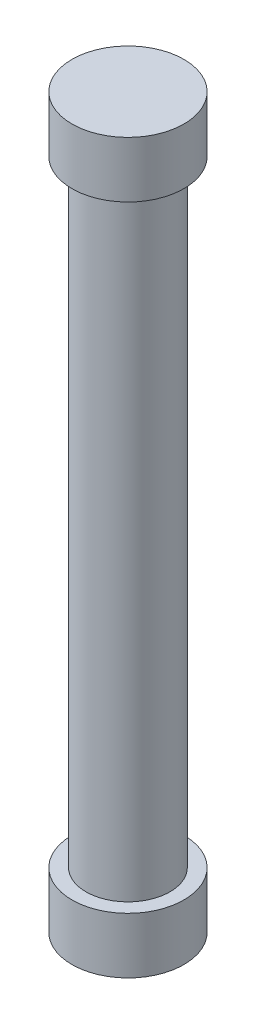
ISO-10303-21;
HEADER;
FILE_DESCRIPTION(('STEP AP214'),'2;1');
FILE_NAME('part.step','',(''),(''),'','','');
FILE_SCHEMA(('AUTOMOTIVE_DESIGN { 1 0 10303 214 1 1 1 1 }'));
ENDSEC;
DATA;
#1=APPLICATION_CONTEXT('core data for automotive mechanical design processes');
#2=APPLICATION_PROTOCOL_DEFINITION('international standard','automotive_design',2000,#1);
#3=PRODUCT_CONTEXT('',#1,'mechanical');
#4=PRODUCT('Part','Part','',(#3));
#5=PRODUCT_RELATED_PRODUCT_CATEGORY('part','',(#4));
#6=PRODUCT_DEFINITION_FORMATION('','',#4);
#7=PRODUCT_DEFINITION_CONTEXT('part definition',#1,'design');
#8=PRODUCT_DEFINITION('design','',#6,#7);
#9=PRODUCT_DEFINITION_SHAPE('','',#8);
#10=(LENGTH_UNIT() NAMED_UNIT(*) SI_UNIT(.MILLI.,.METRE.));
#11=(NAMED_UNIT(*) PLANE_ANGLE_UNIT() SI_UNIT($,.RADIAN.));
#12=(NAMED_UNIT(*) SI_UNIT($,.STERADIAN.) SOLID_ANGLE_UNIT());
#13=UNCERTAINTY_MEASURE_WITH_UNIT(LENGTH_MEASURE(1.E-05),#10,'distance_accuracy_value','');
#14=(GEOMETRIC_REPRESENTATION_CONTEXT(3) GLOBAL_UNCERTAINTY_ASSIGNED_CONTEXT((#13)) GLOBAL_UNIT_ASSIGNED_CONTEXT((#10,
#11,#12)) REPRESENTATION_CONTEXT('',''));
#15=CARTESIAN_POINT('',(0.,0.,0.));
#16=DIRECTION('',(0.,0.,1.));
#17=DIRECTION('',(1.,0.,0.));
#18=AXIS2_PLACEMENT_3D('',#15,#16,#17);
#19=CARTESIAN_POINT('',(-2.,5.07317073170731,0.));
#20=DIRECTION('',(0.,1.,0.));
#21=DIRECTION('',(-1.,0.,0.));
#22=AXIS2_PLACEMENT_3D('',#19,#20,#21);
#23=PLANE('',#22);
#24=CARTESIAN_POINT('',(0.,5.07317073170731,0.));
#25=DIRECTION('',(0.,1.,0.));
#26=DIRECTION('',(-1.,0.,0.));
#27=AXIS2_PLACEMENT_3D('',#24,#25,#26);
#28=CIRCLE('',#27,2.);
#29=CARTESIAN_POINT('',(-2.,5.07317073170731,0.));
#30=VERTEX_POINT('',#29);
#31=EDGE_CURVE('E64',#30,#30,#28,.T.);
#32=ORIENTED_EDGE('',*,*,#31,.T.);
#33=EDGE_LOOP('',(#32));
#34=FACE_BOUND('',#33,.T.);
#35=ADVANCED_FACE('F37',(#34),#23,.T.);
#36=CARTESIAN_POINT('',(0.,-20.9268292682927,0.));
#37=DIRECTION('',(0.,-1.,0.));
#38=DIRECTION('',(1.,0.,0.));
#39=AXIS2_PLACEMENT_3D('',#36,#37,#38);
#40=PLANE('',#39);
#41=CARTESIAN_POINT('',(0.,-20.9268292682927,0.));
#42=DIRECTION('',(0.,1.,0.));
#43=DIRECTION('',(-1.,0.,0.));
#44=AXIS2_PLACEMENT_3D('',#41,#42,#43);
#45=CIRCLE('',#44,2.);
#46=CARTESIAN_POINT('',(-2.,-20.9268292682927,0.));
#47=VERTEX_POINT('',#46);
#48=EDGE_CURVE('E10',#47,#47,#45,.T.);
#49=ORIENTED_EDGE('',*,*,#48,.F.);
#50=EDGE_LOOP('',(#49));
#51=FACE_BOUND('',#50,.T.);
#52=ADVANCED_FACE('F82',(#51),#40,.T.);
#53=CARTESIAN_POINT('',(0.,5.07317073170731,0.));
#54=DIRECTION('',(0.,1.,0.));
#55=DIRECTION('',(-1.,0.,0.));
#56=AXIS2_PLACEMENT_3D('',#53,#54,#55);
#57=CYLINDRICAL_SURFACE('',#56,2.);
#58=ORIENTED_EDGE('',*,*,#48,.T.);
#59=EDGE_LOOP('',(#58));
#60=FACE_BOUND('',#59,.T.);
#61=CARTESIAN_POINT('',(0.,-18.9268292682927,0.));
#62=DIRECTION('',(0.,1.,0.));
#63=DIRECTION('',(-1.,0.,0.));
#64=AXIS2_PLACEMENT_3D('',#61,#62,#63);
#65=CIRCLE('',#64,2.);
#66=CARTESIAN_POINT('',(-2.,-18.9268292682927,0.));
#67=VERTEX_POINT('',#66);
#68=EDGE_CURVE('E44',#67,#67,#65,.T.);
#69=ORIENTED_EDGE('',*,*,#68,.F.);
#70=EDGE_LOOP('',(#69));
#71=FACE_BOUND('',#70,.T.);
#72=ADVANCED_FACE('F86',(#60,#71),#57,.T.);
#73=CARTESIAN_POINT('',(-2.,-18.9268292682927,0.));
#74=DIRECTION('',(0.,1.,0.));
#75=DIRECTION('',(-1.,0.,0.));
#76=AXIS2_PLACEMENT_3D('',#73,#74,#75);
#77=PLANE('',#76);
#78=ORIENTED_EDGE('',*,*,#68,.T.);
#79=EDGE_LOOP('',(#78));
#80=FACE_BOUND('',#79,.T.);
#81=CARTESIAN_POINT('',(0.,-18.9268292682927,0.));
#82=DIRECTION('',(0.,1.,0.));
#83=DIRECTION('',(-1.,0.,0.));
#84=AXIS2_PLACEMENT_3D('',#81,#82,#83);
#85=CIRCLE('',#84,1.5);
#86=CARTESIAN_POINT('',(-1.5,-18.9268292682927,0.));
#87=VERTEX_POINT('',#86);
#88=EDGE_CURVE('E49',#87,#87,#85,.T.);
#89=ORIENTED_EDGE('',*,*,#88,.F.);
#90=EDGE_LOOP('',(#89));
#91=FACE_BOUND('',#90,.T.);
#92=ADVANCED_FACE('F91',(#80,#91),#77,.T.);
#93=CARTESIAN_POINT('',(0.,5.07317073170731,0.));
#94=DIRECTION('',(0.,1.,0.));
#95=DIRECTION('',(-1.,0.,0.));
#96=AXIS2_PLACEMENT_3D('',#93,#94,#95);
#97=CYLINDRICAL_SURFACE('',#96,1.5);
#98=ORIENTED_EDGE('',*,*,#88,.T.);
#99=EDGE_LOOP('',(#98));
#100=FACE_BOUND('',#99,.T.);
#101=CARTESIAN_POINT('',(0.,3.07317073170731,0.));
#102=DIRECTION('',(0.,1.,0.));
#103=DIRECTION('',(-1.,0.,0.));
#104=AXIS2_PLACEMENT_3D('',#101,#102,#103);
#105=CIRCLE('',#104,1.5);
#106=CARTESIAN_POINT('',(-1.5,3.07317073170731,0.));
#107=VERTEX_POINT('',#106);
#108=EDGE_CURVE('E54',#107,#107,#105,.T.);
#109=ORIENTED_EDGE('',*,*,#108,.F.);
#110=EDGE_LOOP('',(#109));
#111=FACE_BOUND('',#110,.T.);
#112=ADVANCED_FACE('F78',(#100,#111),#97,.T.);
#113=CARTESIAN_POINT('',(-1.5,3.07317073170731,0.));
#114=DIRECTION('',(0.,-1.,0.));
#115=DIRECTION('',(1.,0.,0.));
#116=AXIS2_PLACEMENT_3D('',#113,#114,#115);
#117=PLANE('',#116);
#118=ORIENTED_EDGE('',*,*,#108,.T.);
#119=EDGE_LOOP('',(#118));
#120=FACE_BOUND('',#119,.T.);
#121=CARTESIAN_POINT('',(0.,3.07317073170731,0.));
#122=DIRECTION('',(0.,1.,0.));
#123=DIRECTION('',(-1.,0.,0.));
#124=AXIS2_PLACEMENT_3D('',#121,#122,#123);
#125=CIRCLE('',#124,2.);
#126=CARTESIAN_POINT('',(-2.,3.07317073170731,0.));
#127=VERTEX_POINT('',#126);
#128=EDGE_CURVE('E60',#127,#127,#125,.T.);
#129=ORIENTED_EDGE('',*,*,#128,.F.);
#130=EDGE_LOOP('',(#129));
#131=FACE_BOUND('',#130,.T.);
#132=ADVANCED_FACE('F72',(#120,#131),#117,.T.);
#133=CARTESIAN_POINT('',(0.,5.07317073170731,0.));
#134=DIRECTION('',(0.,1.,0.));
#135=DIRECTION('',(-1.,0.,0.));
#136=AXIS2_PLACEMENT_3D('',#133,#134,#135);
#137=CYLINDRICAL_SURFACE('',#136,2.);
#138=ORIENTED_EDGE('',*,*,#128,.T.);
#139=EDGE_LOOP('',(#138));
#140=FACE_BOUND('',#139,.T.);
#141=ORIENTED_EDGE('',*,*,#31,.F.);
#142=EDGE_LOOP('',(#141));
#143=FACE_BOUND('',#142,.T.);
#144=ADVANCED_FACE('F70',(#140,#143),#137,.T.);
#145=CLOSED_SHELL('',(#35,#52,#72,#92,#112,#132,#144));
#146=MANIFOLD_SOLID_BREP('B2',#145);
#147=ADVANCED_BREP_SHAPE_REPRESENTATION('',(#18,#146),#14);
#148=SHAPE_DEFINITION_REPRESENTATION(#9,#147);
ENDSEC;
END-ISO-10303-21;
